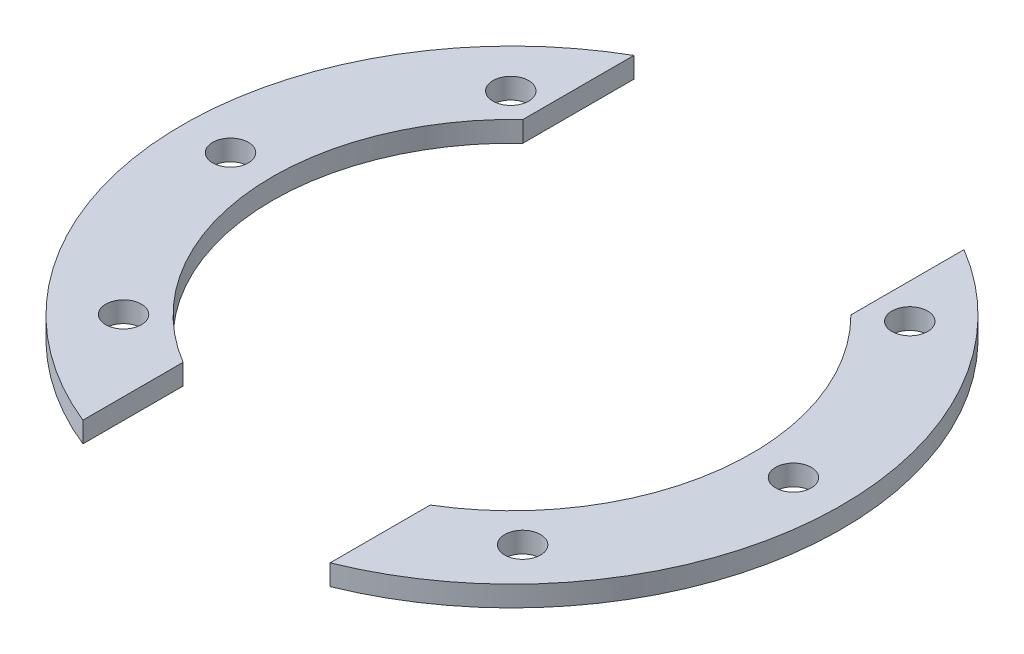
ISO-10303-21;
HEADER;
FILE_DESCRIPTION(('STEP AP214'),'2;1');
FILE_NAME('part.step','',(''),(''),'','','');
FILE_SCHEMA(('AUTOMOTIVE_DESIGN { 1 0 10303 214 1 1 1 1 }'));
ENDSEC;
DATA;
#1=APPLICATION_CONTEXT('core data for automotive mechanical design processes');
#2=APPLICATION_PROTOCOL_DEFINITION('international standard','automotive_design',2000,#1);
#3=PRODUCT_CONTEXT('',#1,'mechanical');
#4=PRODUCT('Part','Part','',(#3));
#5=PRODUCT_RELATED_PRODUCT_CATEGORY('part','',(#4));
#6=PRODUCT_DEFINITION_FORMATION('','',#4);
#7=PRODUCT_DEFINITION_CONTEXT('part definition',#1,'design');
#8=PRODUCT_DEFINITION('design','',#6,#7);
#9=PRODUCT_DEFINITION_SHAPE('','',#8);
#10=(LENGTH_UNIT() NAMED_UNIT(*) SI_UNIT(.MILLI.,.METRE.));
#11=(NAMED_UNIT(*) PLANE_ANGLE_UNIT() SI_UNIT($,.RADIAN.));
#12=(NAMED_UNIT(*) SI_UNIT($,.STERADIAN.) SOLID_ANGLE_UNIT());
#13=UNCERTAINTY_MEASURE_WITH_UNIT(LENGTH_MEASURE(1.E-05),#10,'distance_accuracy_value','');
#14=(GEOMETRIC_REPRESENTATION_CONTEXT(3) GLOBAL_UNCERTAINTY_ASSIGNED_CONTEXT((#13)) GLOBAL_UNIT_ASSIGNED_CONTEXT((#10,
#11,#12)) REPRESENTATION_CONTEXT('',''));
#15=CARTESIAN_POINT('',(0.,0.,0.));
#16=DIRECTION('',(0.,0.,1.));
#17=DIRECTION('',(1.,0.,0.));
#18=AXIS2_PLACEMENT_3D('',#15,#16,#17);
#19=CARTESIAN_POINT('',(12.3277250440958,1.5,0.));
#20=DIRECTION('',(-1.,0.,0.));
#21=DIRECTION('',(0.,0.,1.));
#22=AXIS2_PLACEMENT_3D('',#19,#20,#21);
#23=PLANE('',#22);
#24=DIRECTION('',(0.,0.,-1.));
#25=VECTOR('',#24,1.);
#26=CARTESIAN_POINT('',(12.3277250440958,0.,0.));
#27=LINE('',#26,#25);
#28=CARTESIAN_POINT('',(12.3277250440958,0.,-12.3556773757514));
#29=VERTEX_POINT('',#28);
#30=CARTESIAN_POINT('',(12.3277250440958,0.,-20.5919206301202));
#31=VERTEX_POINT('',#30);
#32=EDGE_CURVE('E118',#29,#31,#27,.T.);
#33=ORIENTED_EDGE('',*,*,#32,.F.);
#34=DIRECTION('',(0.,-1.,0.));
#35=VECTOR('',#34,1.);
#36=CARTESIAN_POINT('',(12.3277250440958,1.5,-12.3556773757514));
#37=LINE('',#36,#35);
#38=CARTESIAN_POINT('',(12.3277250440958,1.5,-12.3556773757514));
#39=VERTEX_POINT('',#38);
#40=EDGE_CURVE('E12',#39,#29,#37,.T.);
#41=ORIENTED_EDGE('',*,*,#40,.F.);
#42=DIRECTION('',(0.,0.,-1.));
#43=VECTOR('',#42,1.);
#44=CARTESIAN_POINT('',(12.3277250440958,1.5,0.));
#45=LINE('',#44,#43);
#46=CARTESIAN_POINT('',(12.3277250440958,1.5,-20.5919206301202));
#47=VERTEX_POINT('',#46);
#48=EDGE_CURVE('E94',#39,#47,#45,.T.);
#49=ORIENTED_EDGE('',*,*,#48,.T.);
#50=DIRECTION('',(0.,-1.,0.));
#51=VECTOR('',#50,1.);
#52=CARTESIAN_POINT('',(12.3277250440958,1.5,-20.5919206301202));
#53=LINE('',#52,#51);
#54=EDGE_CURVE('E83',#47,#31,#53,.T.);
#55=ORIENTED_EDGE('',*,*,#54,.T.);
#56=EDGE_LOOP('',(#33,#41,#49,#55));
#57=FACE_BOUND('',#56,.T.);
#58=ADVANCED_FACE('F45',(#57),#23,.T.);
#59=CARTESIAN_POINT('',(0.,1.5,0.));
#60=DIRECTION('',(0.,-1.,0.));
#61=DIRECTION('',(0.,0.,-1.));
#62=AXIS2_PLACEMENT_3D('',#59,#60,#61);
#63=CYLINDRICAL_SURFACE('',#62,17.4538124252692);
#64=CARTESIAN_POINT('',(0.,0.,0.));
#65=DIRECTION('',(0.,1.,0.));
#66=DIRECTION('',(0.,0.,1.));
#67=AXIS2_PLACEMENT_3D('',#64,#65,#66);
#68=CIRCLE('',#67,17.4538124252692);
#69=CARTESIAN_POINT('',(9.,0.,14.95444977846));
#70=VERTEX_POINT('',#69);
#71=EDGE_CURVE('E100',#29,#70,#68,.F.);
#72=ORIENTED_EDGE('',*,*,#71,.T.);
#73=DIRECTION('',(0.,-1.,0.));
#74=VECTOR('',#73,1.);
#75=CARTESIAN_POINT('',(9.,1.5,14.95444977846));
#76=LINE('',#75,#74);
#77=CARTESIAN_POINT('',(9.,1.5,14.95444977846));
#78=VERTEX_POINT('',#77);
#79=EDGE_CURVE('E53',#78,#70,#76,.T.);
#80=ORIENTED_EDGE('',*,*,#79,.F.);
#81=CARTESIAN_POINT('',(0.,1.5,0.));
#82=DIRECTION('',(0.,1.,0.));
#83=DIRECTION('',(0.,0.,1.));
#84=AXIS2_PLACEMENT_3D('',#81,#82,#83);
#85=CIRCLE('',#84,17.4538124252692);
#86=EDGE_CURVE('E88',#39,#78,#85,.F.);
#87=ORIENTED_EDGE('',*,*,#86,.F.);
#88=ORIENTED_EDGE('',*,*,#40,.T.);
#89=EDGE_LOOP('',(#72,#80,#87,#88));
#90=FACE_BOUND('',#89,.T.);
#91=ADVANCED_FACE('F98',(#90),#63,.F.);
#92=CARTESIAN_POINT('',(8.99999999999999,1.5,0.));
#93=DIRECTION('',(-1.,0.,0.));
#94=DIRECTION('',(0.,0.,1.));
#95=AXIS2_PLACEMENT_3D('',#92,#93,#94);
#96=PLANE('',#95);
#97=DIRECTION('',(0.,0.,-1.));
#98=VECTOR('',#97,1.);
#99=CARTESIAN_POINT('',(8.99999999999999,0.,0.));
#100=LINE('',#99,#98);
#101=CARTESIAN_POINT('',(9.,0.,22.248595461287));
#102=VERTEX_POINT('',#101);
#103=EDGE_CURVE('E122',#102,#70,#100,.T.);
#104=ORIENTED_EDGE('',*,*,#103,.F.);
#105=DIRECTION('',(0.,-1.,0.));
#106=VECTOR('',#105,1.);
#107=CARTESIAN_POINT('',(9.,1.5,22.248595461287));
#108=LINE('',#107,#106);
#109=CARTESIAN_POINT('',(9.,1.5,22.248595461287));
#110=VERTEX_POINT('',#109);
#111=EDGE_CURVE('E76',#110,#102,#108,.T.);
#112=ORIENTED_EDGE('',*,*,#111,.F.);
#113=DIRECTION('',(0.,0.,-1.));
#114=VECTOR('',#113,1.);
#115=CARTESIAN_POINT('',(8.99999999999999,1.5,0.));
#116=LINE('',#115,#114);
#117=EDGE_CURVE('E93',#110,#78,#116,.T.);
#118=ORIENTED_EDGE('',*,*,#117,.T.);
#119=ORIENTED_EDGE('',*,*,#79,.T.);
#120=EDGE_LOOP('',(#104,#112,#118,#119));
#121=FACE_BOUND('',#120,.T.);
#122=ADVANCED_FACE('F104',(#121),#96,.T.);
#123=CARTESIAN_POINT('',(20.498,1.5,0.));
#124=DIRECTION('',(0.,-1.,0.));
#125=DIRECTION('',(0.,0.,-1.));
#126=AXIS2_PLACEMENT_3D('',#123,#124,#125);
#127=CYLINDRICAL_SURFACE('',#126,1.3);
#128=CARTESIAN_POINT('',(20.498,1.5,0.));
#129=DIRECTION('',(0.,1.,0.));
#130=DIRECTION('',(0.,0.,1.));
#131=AXIS2_PLACEMENT_3D('',#128,#129,#130);
#132=CIRCLE('',#131,1.3);
#133=CARTESIAN_POINT('',(20.498,1.5,1.3));
#134=VERTEX_POINT('',#133);
#135=EDGE_CURVE('E112',#134,#134,#132,.F.);
#136=ORIENTED_EDGE('',*,*,#135,.F.);
#137=EDGE_LOOP('',(#136));
#138=FACE_BOUND('',#137,.T.);
#139=CARTESIAN_POINT('',(20.498,0.,0.));
#140=DIRECTION('',(0.,1.,0.));
#141=DIRECTION('',(0.,0.,1.));
#142=AXIS2_PLACEMENT_3D('',#139,#140,#141);
#143=CIRCLE('',#142,1.3);
#144=CARTESIAN_POINT('',(20.498,0.,1.3));
#145=VERTEX_POINT('',#144);
#146=EDGE_CURVE('E129',#145,#145,#143,.F.);
#147=ORIENTED_EDGE('',*,*,#146,.T.);
#148=EDGE_LOOP('',(#147));
#149=FACE_BOUND('',#148,.T.);
#150=ADVANCED_FACE('F145',(#138,#149),#127,.F.);
#151=CARTESIAN_POINT('',(14.872,1.5,14.097));
#152=DIRECTION('',(0.,-1.,0.));
#153=DIRECTION('',(0.,0.,-1.));
#154=AXIS2_PLACEMENT_3D('',#151,#152,#153);
#155=CYLINDRICAL_SURFACE('',#154,1.3);
#156=CARTESIAN_POINT('',(14.872,1.5,14.097));
#157=DIRECTION('',(0.,1.,0.));
#158=DIRECTION('',(0.,0.,1.));
#159=AXIS2_PLACEMENT_3D('',#156,#157,#158);
#160=CIRCLE('',#159,1.3);
#161=CARTESIAN_POINT('',(14.872,1.5,15.397));
#162=VERTEX_POINT('',#161);
#163=EDGE_CURVE('E106',#162,#162,#160,.F.);
#164=ORIENTED_EDGE('',*,*,#163,.F.);
#165=EDGE_LOOP('',(#164));
#166=FACE_BOUND('',#165,.T.);
#167=CARTESIAN_POINT('',(14.872,0.,14.097));
#168=DIRECTION('',(0.,1.,0.));
#169=DIRECTION('',(0.,0.,1.));
#170=AXIS2_PLACEMENT_3D('',#167,#168,#169);
#171=CIRCLE('',#170,1.3);
#172=CARTESIAN_POINT('',(14.872,0.,15.397));
#173=VERTEX_POINT('',#172);
#174=EDGE_CURVE('E126',#173,#173,#171,.F.);
#175=ORIENTED_EDGE('',*,*,#174,.T.);
#176=EDGE_LOOP('',(#175));
#177=FACE_BOUND('',#176,.T.);
#178=ADVANCED_FACE('F152',(#166,#177),#155,.F.);
#179=CARTESIAN_POINT('',(0.,1.5,0.));
#180=DIRECTION('',(0.,-1.,0.));
#181=DIRECTION('',(0.,0.,-1.));
#182=AXIS2_PLACEMENT_3D('',#179,#180,#181);
#183=CYLINDRICAL_SURFACE('',#182,24.);
#184=CARTESIAN_POINT('',(0.,0.,0.));
#185=DIRECTION('',(0.,1.,0.));
#186=DIRECTION('',(0.,0.,1.));
#187=AXIS2_PLACEMENT_3D('',#184,#185,#186);
#188=CIRCLE('',#187,24.);
#189=EDGE_CURVE('E124',#102,#31,#188,.T.);
#190=ORIENTED_EDGE('',*,*,#189,.T.);
#191=ORIENTED_EDGE('',*,*,#54,.F.);
#192=CARTESIAN_POINT('',(0.,1.5,0.));
#193=DIRECTION('',(0.,1.,0.));
#194=DIRECTION('',(0.,0.,1.));
#195=AXIS2_PLACEMENT_3D('',#192,#193,#194);
#196=CIRCLE('',#195,24.);
#197=EDGE_CURVE('E61',#110,#47,#196,.T.);
#198=ORIENTED_EDGE('',*,*,#197,.F.);
#199=ORIENTED_EDGE('',*,*,#111,.T.);
#200=EDGE_LOOP('',(#190,#191,#198,#199));
#201=FACE_BOUND('',#200,.T.);
#202=ADVANCED_FACE('F148',(#201),#183,.T.);
#203=CARTESIAN_POINT('',(14.872,1.5,-14.097));
#204=DIRECTION('',(0.,-1.,0.));
#205=DIRECTION('',(0.,0.,-1.));
#206=AXIS2_PLACEMENT_3D('',#203,#204,#205);
#207=CYLINDRICAL_SURFACE('',#206,1.3);
#208=CARTESIAN_POINT('',(14.872,1.5,-14.097));
#209=DIRECTION('',(0.,1.,0.));
#210=DIRECTION('',(0.,0.,1.));
#211=AXIS2_PLACEMENT_3D('',#208,#209,#210);
#212=CIRCLE('',#211,1.3);
#213=CARTESIAN_POINT('',(14.872,1.5,-12.797));
#214=VERTEX_POINT('',#213);
#215=EDGE_CURVE('E115',#214,#214,#212,.T.);
#216=ORIENTED_EDGE('',*,*,#215,.T.);
#217=EDGE_LOOP('',(#216));
#218=FACE_BOUND('',#217,.T.);
#219=CARTESIAN_POINT('',(14.872,0.,-14.097));
#220=DIRECTION('',(0.,1.,0.));
#221=DIRECTION('',(0.,0.,1.));
#222=AXIS2_PLACEMENT_3D('',#219,#220,#221);
#223=CIRCLE('',#222,1.3);
#224=CARTESIAN_POINT('',(14.872,0.,-12.797));
#225=VERTEX_POINT('',#224);
#226=EDGE_CURVE('E132',#225,#225,#223,.T.);
#227=ORIENTED_EDGE('',*,*,#226,.F.);
#228=EDGE_LOOP('',(#227));
#229=FACE_BOUND('',#228,.T.);
#230=ADVANCED_FACE('F151',(#218,#229),#207,.F.);
#231=CARTESIAN_POINT('',(0.,1.5,0.));
#232=DIRECTION('',(0.,1.,0.));
#233=DIRECTION('',(0.,0.,1.));
#234=AXIS2_PLACEMENT_3D('',#231,#232,#233);
#235=PLANE('',#234);
#236=ORIENTED_EDGE('',*,*,#48,.F.);
#237=ORIENTED_EDGE('',*,*,#86,.T.);
#238=ORIENTED_EDGE('',*,*,#117,.F.);
#239=ORIENTED_EDGE('',*,*,#197,.T.);
#240=EDGE_LOOP('',(#236,#237,#238,#239));
#241=FACE_BOUND('',#240,.T.);
#242=ORIENTED_EDGE('',*,*,#163,.T.);
#243=EDGE_LOOP('',(#242));
#244=FACE_BOUND('',#243,.T.);
#245=ORIENTED_EDGE('',*,*,#135,.T.);
#246=EDGE_LOOP('',(#245));
#247=FACE_BOUND('',#246,.T.);
#248=ORIENTED_EDGE('',*,*,#215,.F.);
#249=EDGE_LOOP('',(#248));
#250=FACE_BOUND('',#249,.T.);
#251=ADVANCED_FACE('F90',(#241,#244,#247,#250),#235,.T.);
#252=CARTESIAN_POINT('',(0.,0.,0.));
#253=DIRECTION('',(0.,1.,0.));
#254=DIRECTION('',(0.,0.,1.));
#255=AXIS2_PLACEMENT_3D('',#252,#253,#254);
#256=PLANE('',#255);
#257=ORIENTED_EDGE('',*,*,#32,.T.);
#258=ORIENTED_EDGE('',*,*,#189,.F.);
#259=ORIENTED_EDGE('',*,*,#103,.T.);
#260=ORIENTED_EDGE('',*,*,#71,.F.);
#261=EDGE_LOOP('',(#257,#258,#259,#260));
#262=FACE_BOUND('',#261,.T.);
#263=ORIENTED_EDGE('',*,*,#174,.F.);
#264=EDGE_LOOP('',(#263));
#265=FACE_BOUND('',#264,.T.);
#266=ORIENTED_EDGE('',*,*,#146,.F.);
#267=EDGE_LOOP('',(#266));
#268=FACE_BOUND('',#267,.T.);
#269=ORIENTED_EDGE('',*,*,#226,.T.);
#270=EDGE_LOOP('',(#269));
#271=FACE_BOUND('',#270,.T.);
#272=ADVANCED_FACE('F162',(#262,#265,#268,#271),#256,.F.);
#273=CLOSED_SHELL('',(#58,#91,#122,#150,#178,#202,#230,#251,#272));
#274=MANIFOLD_SOLID_BREP('B2',#273);
#275=CARTESIAN_POINT('',(0.,1.5,0.));
#276=DIRECTION('',(0.,-1.,0.));
#277=DIRECTION('',(0.,0.,-1.));
#278=AXIS2_PLACEMENT_3D('',#275,#276,#277);
#279=CYLINDRICAL_SURFACE('',#278,17.4538124252692);
#280=CARTESIAN_POINT('',(0.,0.,0.));
#281=DIRECTION('',(0.,1.,0.));
#282=DIRECTION('',(0.,0.,1.));
#283=AXIS2_PLACEMENT_3D('',#280,#281,#282);
#284=CIRCLE('',#283,17.4538124252692);
#285=CARTESIAN_POINT('',(-8.99999999999999,0.,14.95444977846));
#286=VERTEX_POINT('',#285);
#287=CARTESIAN_POINT('',(-11.9399658850854,0.,-12.7307809202531));
#288=VERTEX_POINT('',#287);
#289=EDGE_CURVE('E326',#286,#288,#284,.F.);
#290=ORIENTED_EDGE('',*,*,#289,.T.);
#291=DIRECTION('',(0.,-1.,0.));
#292=VECTOR('',#291,1.);
#293=CARTESIAN_POINT('',(-11.9399658850854,1.5,-12.7307809202531));
#294=LINE('',#293,#292);
#295=CARTESIAN_POINT('',(-11.9399658850854,1.5,-12.7307809202531));
#296=VERTEX_POINT('',#295);
#297=EDGE_CURVE('E43',#296,#288,#294,.T.);
#298=ORIENTED_EDGE('',*,*,#297,.F.);
#299=CARTESIAN_POINT('',(0.,1.5,0.));
#300=DIRECTION('',(0.,1.,0.));
#301=DIRECTION('',(0.,0.,1.));
#302=AXIS2_PLACEMENT_3D('',#299,#300,#301);
#303=CIRCLE('',#302,17.4538124252692);
#304=CARTESIAN_POINT('',(-8.99999999999999,1.5,14.95444977846));
#305=VERTEX_POINT('',#304);
#306=EDGE_CURVE('E305',#305,#296,#303,.F.);
#307=ORIENTED_EDGE('',*,*,#306,.F.);
#308=DIRECTION('',(0.,-1.,0.));
#309=VECTOR('',#308,1.);
#310=CARTESIAN_POINT('',(-8.99999999999999,1.5,14.95444977846));
#311=LINE('',#310,#309);
#312=EDGE_CURVE('E325',#305,#286,#311,.T.);
#313=ORIENTED_EDGE('',*,*,#312,.T.);
#314=EDGE_LOOP('',(#290,#298,#307,#313));
#315=FACE_BOUND('',#314,.T.);
#316=ADVANCED_FACE('F253',(#315),#279,.F.);
#317=CARTESIAN_POINT('',(-11.9399658850854,1.5,0.));
#318=DIRECTION('',(-1.,0.,0.));
#319=DIRECTION('',(0.,0.,1.));
#320=AXIS2_PLACEMENT_3D('',#317,#318,#319);
#321=PLANE('',#320);
#322=DIRECTION('',(0.,0.,-1.));
#323=VECTOR('',#322,1.);
#324=CARTESIAN_POINT('',(-11.9399658850854,0.,0.));
#325=LINE('',#324,#323);
#326=CARTESIAN_POINT('',(-11.9399658850854,0.,-20.8191549939712));
#327=VERTEX_POINT('',#326);
#328=EDGE_CURVE('E309',#288,#327,#325,.T.);
#329=ORIENTED_EDGE('',*,*,#328,.T.);
#330=DIRECTION('',(0.,-1.,0.));
#331=VECTOR('',#330,1.);
#332=CARTESIAN_POINT('',(-11.9399658850854,1.5,-20.8191549939712));
#333=LINE('',#332,#331);
#334=CARTESIAN_POINT('',(-11.9399658850854,1.5,-20.8191549939712));
#335=VERTEX_POINT('',#334);
#336=EDGE_CURVE('E261',#335,#327,#333,.T.);
#337=ORIENTED_EDGE('',*,*,#336,.F.);
#338=DIRECTION('',(0.,0.,-1.));
#339=VECTOR('',#338,1.);
#340=CARTESIAN_POINT('',(-11.9399658850854,1.5,0.));
#341=LINE('',#340,#339);
#342=EDGE_CURVE('E299',#296,#335,#341,.T.);
#343=ORIENTED_EDGE('',*,*,#342,.F.);
#344=ORIENTED_EDGE('',*,*,#297,.T.);
#345=EDGE_LOOP('',(#329,#337,#343,#344));
#346=FACE_BOUND('',#345,.T.);
#347=ADVANCED_FACE('F308',(#346),#321,.F.);
#348=CARTESIAN_POINT('',(0.,1.5,0.));
#349=DIRECTION('',(0.,-1.,0.));
#350=DIRECTION('',(0.,0.,-1.));
#351=AXIS2_PLACEMENT_3D('',#348,#349,#350);
#352=CYLINDRICAL_SURFACE('',#351,24.);
#353=CARTESIAN_POINT('',(0.,0.,0.));
#354=DIRECTION('',(0.,1.,0.));
#355=DIRECTION('',(0.,0.,1.));
#356=AXIS2_PLACEMENT_3D('',#353,#354,#355);
#357=CIRCLE('',#356,24.);
#358=CARTESIAN_POINT('',(-8.99999999999999,0.,22.248595461287));
#359=VERTEX_POINT('',#358);
#360=EDGE_CURVE('E286',#327,#359,#357,.T.);
#361=ORIENTED_EDGE('',*,*,#360,.T.);
#362=DIRECTION('',(0.,-1.,0.));
#363=VECTOR('',#362,1.);
#364=CARTESIAN_POINT('',(-8.99999999999999,1.5,22.248595461287));
#365=LINE('',#364,#363);
#366=CARTESIAN_POINT('',(-8.99999999999999,1.5,22.248595461287));
#367=VERTEX_POINT('',#366);
#368=EDGE_CURVE('E310',#367,#359,#365,.T.);
#369=ORIENTED_EDGE('',*,*,#368,.F.);
#370=CARTESIAN_POINT('',(0.,1.5,0.));
#371=DIRECTION('',(0.,1.,0.));
#372=DIRECTION('',(0.,0.,1.));
#373=AXIS2_PLACEMENT_3D('',#370,#371,#372);
#374=CIRCLE('',#373,24.);
#375=EDGE_CURVE('E303',#335,#367,#374,.T.);
#376=ORIENTED_EDGE('',*,*,#375,.F.);
#377=ORIENTED_EDGE('',*,*,#336,.T.);
#378=EDGE_LOOP('',(#361,#369,#376,#377));
#379=FACE_BOUND('',#378,.T.);
#380=ADVANCED_FACE('F311',(#379),#352,.T.);
#381=CARTESIAN_POINT('',(-20.498,1.5,0.));
#382=DIRECTION('',(0.,-1.,0.));
#383=DIRECTION('',(0.,0.,-1.));
#384=AXIS2_PLACEMENT_3D('',#381,#382,#383);
#385=CYLINDRICAL_SURFACE('',#384,1.3);
#386=CARTESIAN_POINT('',(-20.498,1.5,0.));
#387=DIRECTION('',(0.,1.,0.));
#388=DIRECTION('',(0.,0.,1.));
#389=AXIS2_PLACEMENT_3D('',#386,#387,#388);
#390=CIRCLE('',#389,1.3);
#391=CARTESIAN_POINT('',(-20.498,1.5,1.3));
#392=VERTEX_POINT('',#391);
#393=EDGE_CURVE('E319',#392,#392,#390,.T.);
#394=ORIENTED_EDGE('',*,*,#393,.T.);
#395=EDGE_LOOP('',(#394));
#396=FACE_BOUND('',#395,.T.);
#397=CARTESIAN_POINT('',(-20.498,0.,0.));
#398=DIRECTION('',(0.,1.,0.));
#399=DIRECTION('',(0.,0.,1.));
#400=AXIS2_PLACEMENT_3D('',#397,#398,#399);
#401=CIRCLE('',#400,1.3);
#402=CARTESIAN_POINT('',(-20.498,0.,1.3));
#403=VERTEX_POINT('',#402);
#404=EDGE_CURVE('E335',#403,#403,#401,.T.);
#405=ORIENTED_EDGE('',*,*,#404,.F.);
#406=EDGE_LOOP('',(#405));
#407=FACE_BOUND('',#406,.T.);
#408=ADVANCED_FACE('F355',(#396,#407),#385,.F.);
#409=CARTESIAN_POINT('',(-14.187,1.5,-14.1));
#410=DIRECTION('',(0.,-1.,0.));
#411=DIRECTION('',(0.,0.,-1.));
#412=AXIS2_PLACEMENT_3D('',#409,#410,#411);
#413=CYLINDRICAL_SURFACE('',#412,1.3);
#414=CARTESIAN_POINT('',(-14.187,1.5,-14.1));
#415=DIRECTION('',(0.,1.,0.));
#416=DIRECTION('',(0.,0.,1.));
#417=AXIS2_PLACEMENT_3D('',#414,#415,#416);
#418=CIRCLE('',#417,1.3);
#419=CARTESIAN_POINT('',(-14.187,1.5,-12.8));
#420=VERTEX_POINT('',#419);
#421=EDGE_CURVE('E313',#420,#420,#418,.T.);
#422=ORIENTED_EDGE('',*,*,#421,.T.);
#423=EDGE_LOOP('',(#422));
#424=FACE_BOUND('',#423,.T.);
#425=CARTESIAN_POINT('',(-14.187,0.,-14.1));
#426=DIRECTION('',(0.,1.,0.));
#427=DIRECTION('',(0.,0.,1.));
#428=AXIS2_PLACEMENT_3D('',#425,#426,#427);
#429=CIRCLE('',#428,1.3);
#430=CARTESIAN_POINT('',(-14.187,0.,-12.8));
#431=VERTEX_POINT('',#430);
#432=EDGE_CURVE('E332',#431,#431,#429,.T.);
#433=ORIENTED_EDGE('',*,*,#432,.F.);
#434=EDGE_LOOP('',(#433));
#435=FACE_BOUND('',#434,.T.);
#436=ADVANCED_FACE('F361',(#424,#435),#413,.F.);
#437=CARTESIAN_POINT('',(-9.,1.5,0.));
#438=DIRECTION('',(-1.,0.,0.));
#439=DIRECTION('',(0.,0.,1.));
#440=AXIS2_PLACEMENT_3D('',#437,#438,#439);
#441=PLANE('',#440);
#442=DIRECTION('',(0.,0.,-1.));
#443=VECTOR('',#442,1.);
#444=CARTESIAN_POINT('',(-9.,0.,0.));
#445=LINE('',#444,#443);
#446=EDGE_CURVE('E292',#359,#286,#445,.T.);
#447=ORIENTED_EDGE('',*,*,#446,.T.);
#448=ORIENTED_EDGE('',*,*,#312,.F.);
#449=DIRECTION('',(0.,0.,-1.));
#450=VECTOR('',#449,1.);
#451=CARTESIAN_POINT('',(-9.,1.5,0.));
#452=LINE('',#451,#450);
#453=EDGE_CURVE('E269',#367,#305,#452,.T.);
#454=ORIENTED_EDGE('',*,*,#453,.F.);
#455=ORIENTED_EDGE('',*,*,#368,.T.);
#456=EDGE_LOOP('',(#447,#448,#454,#455));
#457=FACE_BOUND('',#456,.T.);
#458=ADVANCED_FACE('F342',(#457),#441,.F.);
#459=CARTESIAN_POINT('',(-14.187,1.5,14.1));
#460=DIRECTION('',(0.,-1.,0.));
#461=DIRECTION('',(0.,0.,-1.));
#462=AXIS2_PLACEMENT_3D('',#459,#460,#461);
#463=CYLINDRICAL_SURFACE('',#462,1.3);
#464=CARTESIAN_POINT('',(-14.187,1.5,14.1));
#465=DIRECTION('',(0.,1.,0.));
#466=DIRECTION('',(0.,0.,1.));
#467=AXIS2_PLACEMENT_3D('',#464,#465,#466);
#468=CIRCLE('',#467,1.3);
#469=CARTESIAN_POINT('',(-14.187,1.5,15.4));
#470=VERTEX_POINT('',#469);
#471=EDGE_CURVE('E322',#470,#470,#468,.F.);
#472=ORIENTED_EDGE('',*,*,#471,.F.);
#473=EDGE_LOOP('',(#472));
#474=FACE_BOUND('',#473,.T.);
#475=CARTESIAN_POINT('',(-14.187,0.,14.1));
#476=DIRECTION('',(0.,1.,0.));
#477=DIRECTION('',(0.,0.,1.));
#478=AXIS2_PLACEMENT_3D('',#475,#476,#477);
#479=CIRCLE('',#478,1.3);
#480=CARTESIAN_POINT('',(-14.187,0.,15.4));
#481=VERTEX_POINT('',#480);
#482=EDGE_CURVE('E338',#481,#481,#479,.F.);
#483=ORIENTED_EDGE('',*,*,#482,.T.);
#484=EDGE_LOOP('',(#483));
#485=FACE_BOUND('',#484,.T.);
#486=ADVANCED_FACE('F360',(#474,#485),#463,.F.);
#487=CARTESIAN_POINT('',(0.,1.5,0.));
#488=DIRECTION('',(0.,1.,0.));
#489=DIRECTION('',(0.,0.,1.));
#490=AXIS2_PLACEMENT_3D('',#487,#488,#489);
#491=PLANE('',#490);
#492=ORIENTED_EDGE('',*,*,#306,.T.);
#493=ORIENTED_EDGE('',*,*,#342,.T.);
#494=ORIENTED_EDGE('',*,*,#375,.T.);
#495=ORIENTED_EDGE('',*,*,#453,.T.);
#496=EDGE_LOOP('',(#492,#493,#494,#495));
#497=FACE_BOUND('',#496,.T.);
#498=ORIENTED_EDGE('',*,*,#421,.F.);
#499=EDGE_LOOP('',(#498));
#500=FACE_BOUND('',#499,.T.);
#501=ORIENTED_EDGE('',*,*,#393,.F.);
#502=EDGE_LOOP('',(#501));
#503=FACE_BOUND('',#502,.T.);
#504=ORIENTED_EDGE('',*,*,#471,.T.);
#505=EDGE_LOOP('',(#504));
#506=FACE_BOUND('',#505,.T.);
#507=ADVANCED_FACE('F300',(#497,#500,#503,#506),#491,.T.);
#508=CARTESIAN_POINT('',(0.,0.,0.));
#509=DIRECTION('',(0.,1.,0.));
#510=DIRECTION('',(0.,0.,1.));
#511=AXIS2_PLACEMENT_3D('',#508,#509,#510);
#512=PLANE('',#511);
#513=ORIENTED_EDGE('',*,*,#289,.F.);
#514=ORIENTED_EDGE('',*,*,#446,.F.);
#515=ORIENTED_EDGE('',*,*,#360,.F.);
#516=ORIENTED_EDGE('',*,*,#328,.F.);
#517=EDGE_LOOP('',(#513,#514,#515,#516));
#518=FACE_BOUND('',#517,.T.);
#519=ORIENTED_EDGE('',*,*,#432,.T.);
#520=EDGE_LOOP('',(#519));
#521=FACE_BOUND('',#520,.T.);
#522=ORIENTED_EDGE('',*,*,#404,.T.);
#523=EDGE_LOOP('',(#522));
#524=FACE_BOUND('',#523,.T.);
#525=ORIENTED_EDGE('',*,*,#482,.F.);
#526=EDGE_LOOP('',(#525));
#527=FACE_BOUND('',#526,.T.);
#528=ADVANCED_FACE('F345',(#518,#521,#524,#527),#512,.F.);
#529=CLOSED_SHELL('',(#316,#347,#380,#408,#436,#458,#486,#507,#528));
#530=MANIFOLD_SOLID_BREP('B6',#529);
#531=ADVANCED_BREP_SHAPE_REPRESENTATION('',(#18,#274,#530),#14);
#532=SHAPE_DEFINITION_REPRESENTATION(#9,#531);
ENDSEC;
END-ISO-10303-21;
